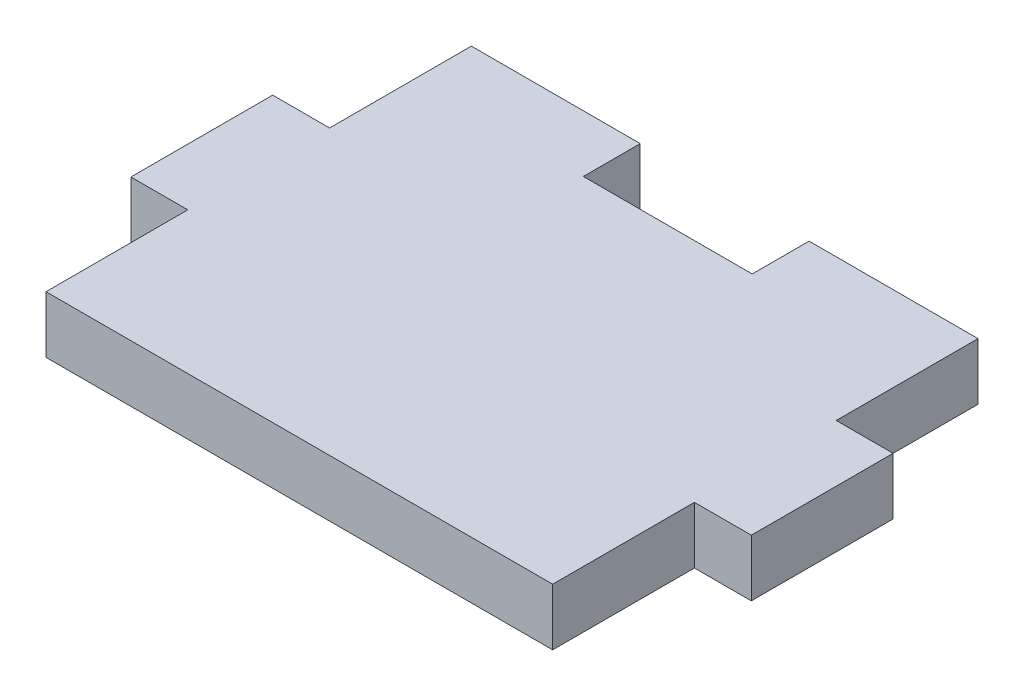
ISO-10303-21;
HEADER;
FILE_DESCRIPTION(('STEP AP214'),'2;1');
FILE_NAME('part.step','',(''),(''),'','','');
FILE_SCHEMA(('AUTOMOTIVE_DESIGN { 1 0 10303 214 1 1 1 1 }'));
ENDSEC;
DATA;
#1=APPLICATION_CONTEXT('core data for automotive mechanical design processes');
#2=APPLICATION_PROTOCOL_DEFINITION('international standard','automotive_design',2000,#1);
#3=PRODUCT_CONTEXT('',#1,'mechanical');
#4=PRODUCT('Part','Part','',(#3));
#5=PRODUCT_RELATED_PRODUCT_CATEGORY('part','',(#4));
#6=PRODUCT_DEFINITION_FORMATION('','',#4);
#7=PRODUCT_DEFINITION_CONTEXT('part definition',#1,'design');
#8=PRODUCT_DEFINITION('design','',#6,#7);
#9=PRODUCT_DEFINITION_SHAPE('','',#8);
#10=(LENGTH_UNIT() NAMED_UNIT(*) SI_UNIT(.MILLI.,.METRE.));
#11=(NAMED_UNIT(*) PLANE_ANGLE_UNIT() SI_UNIT($,.RADIAN.));
#12=(NAMED_UNIT(*) SI_UNIT($,.STERADIAN.) SOLID_ANGLE_UNIT());
#13=UNCERTAINTY_MEASURE_WITH_UNIT(LENGTH_MEASURE(1.E-05),#10,'distance_accuracy_value','');
#14=(GEOMETRIC_REPRESENTATION_CONTEXT(3) GLOBAL_UNCERTAINTY_ASSIGNED_CONTEXT((#13)) GLOBAL_UNIT_ASSIGNED_CONTEXT((#10,
#11,#12)) REPRESENTATION_CONTEXT('',''));
#15=CARTESIAN_POINT('',(0.,0.,0.));
#16=DIRECTION('',(0.,0.,1.));
#17=DIRECTION('',(1.,0.,0.));
#18=AXIS2_PLACEMENT_3D('',#15,#16,#17);
#19=CARTESIAN_POINT('',(-23.749,2.667,-19.939));
#20=DIRECTION('',(0.,0.,1.));
#21=DIRECTION('',(1.,0.,0.));
#22=AXIS2_PLACEMENT_3D('',#19,#20,#21);
#23=PLANE('',#22);
#24=DIRECTION('',(-1.,0.,0.));
#25=VECTOR('',#24,1.);
#26=CARTESIAN_POINT('',(-23.749,2.667,-19.939));
#27=LINE('',#26,#25);
#28=CARTESIAN_POINT('',(-7.91633333333333,2.66700000000001,-19.939));
#29=VERTEX_POINT('',#28);
#30=CARTESIAN_POINT('',(-23.749,2.667,-19.939));
#31=VERTEX_POINT('',#30);
#32=EDGE_CURVE('E172',#29,#31,#27,.T.);
#33=ORIENTED_EDGE('',*,*,#32,.F.);
#34=DIRECTION('',(0.,-1.,0.));
#35=VECTOR('',#34,1.);
#36=CARTESIAN_POINT('',(-7.91633333333333,-2.66699999999999,-19.939));
#37=LINE('',#36,#35);
#38=CARTESIAN_POINT('',(-7.91633333333333,-2.66699999999999,-19.939));
#39=VERTEX_POINT('',#38);
#40=EDGE_CURVE('E164',#29,#39,#37,.T.);
#41=ORIENTED_EDGE('',*,*,#40,.T.);
#42=DIRECTION('',(-1.,0.,0.));
#43=VECTOR('',#42,1.);
#44=CARTESIAN_POINT('',(-23.749,-2.667,-19.939));
#45=LINE('',#44,#43);
#46=CARTESIAN_POINT('',(-23.749,-2.667,-19.939));
#47=VERTEX_POINT('',#46);
#48=EDGE_CURVE('E222',#39,#47,#45,.T.);
#49=ORIENTED_EDGE('',*,*,#48,.T.);
#50=DIRECTION('',(0.,-1.,0.));
#51=VECTOR('',#50,1.);
#52=CARTESIAN_POINT('',(-23.749,2.667,-19.939));
#53=LINE('',#52,#51);
#54=EDGE_CURVE('E208',#31,#47,#53,.T.);
#55=ORIENTED_EDGE('',*,*,#54,.F.);
#56=EDGE_LOOP('',(#33,#41,#49,#55));
#57=FACE_BOUND('',#56,.T.);
#58=ADVANCED_FACE('F33',(#57),#23,.F.);
#59=CARTESIAN_POINT('',(23.749,2.667,19.939));
#60=DIRECTION('',(-1.,0.,0.));
#61=DIRECTION('',(0.,0.,1.));
#62=AXIS2_PLACEMENT_3D('',#59,#60,#61);
#63=PLANE('',#62);
#64=DIRECTION('',(0.,1.,0.));
#65=VECTOR('',#64,1.);
#66=CARTESIAN_POINT('',(23.749,-2.667,-6.64633333333334));
#67=LINE('',#66,#65);
#68=CARTESIAN_POINT('',(23.749,-2.667,-6.64633333333334));
#69=VERTEX_POINT('',#68);
#70=CARTESIAN_POINT('',(23.749,2.667,-6.64633333333334));
#71=VERTEX_POINT('',#70);
#72=EDGE_CURVE('E215',#69,#71,#67,.T.);
#73=ORIENTED_EDGE('',*,*,#72,.F.);
#74=DIRECTION('',(0.,0.,-1.));
#75=VECTOR('',#74,1.);
#76=CARTESIAN_POINT('',(23.749,-2.667,19.939));
#77=LINE('',#76,#75);
#78=CARTESIAN_POINT('',(23.749,-2.667,-19.939));
#79=VERTEX_POINT('',#78);
#80=EDGE_CURVE('E214',#69,#79,#77,.T.);
#81=ORIENTED_EDGE('',*,*,#80,.T.);
#82=DIRECTION('',(0.,-1.,0.));
#83=VECTOR('',#82,1.);
#84=CARTESIAN_POINT('',(23.749,2.667,-19.939));
#85=LINE('',#84,#83);
#86=CARTESIAN_POINT('',(23.749,2.667,-19.939));
#87=VERTEX_POINT('',#86);
#88=EDGE_CURVE('E41',#87,#79,#85,.T.);
#89=ORIENTED_EDGE('',*,*,#88,.F.);
#90=DIRECTION('',(0.,0.,-1.));
#91=VECTOR('',#90,1.);
#92=CARTESIAN_POINT('',(23.749,2.667,19.939));
#93=LINE('',#92,#91);
#94=EDGE_CURVE('E170',#71,#87,#93,.T.);
#95=ORIENTED_EDGE('',*,*,#94,.F.);
#96=EDGE_LOOP('',(#73,#81,#89,#95));
#97=FACE_BOUND('',#96,.T.);
#98=ADVANCED_FACE('F212',(#97),#63,.F.);
#99=CARTESIAN_POINT('',(-23.749,2.667,19.939));
#100=DIRECTION('',(1.,0.,0.));
#101=DIRECTION('',(0.,0.,-1.));
#102=AXIS2_PLACEMENT_3D('',#99,#100,#101);
#103=PLANE('',#102);
#104=DIRECTION('',(0.,1.,0.));
#105=VECTOR('',#104,1.);
#106=CARTESIAN_POINT('',(-23.749,-2.667,6.64633333333333));
#107=LINE('',#106,#105);
#108=CARTESIAN_POINT('',(-23.749,-2.667,6.64633333333333));
#109=VERTEX_POINT('',#108);
#110=CARTESIAN_POINT('',(-23.749,2.667,6.64633333333333));
#111=VERTEX_POINT('',#110);
#112=EDGE_CURVE('E219',#109,#111,#107,.T.);
#113=ORIENTED_EDGE('',*,*,#112,.F.);
#114=DIRECTION('',(0.,0.,1.));
#115=VECTOR('',#114,1.);
#116=CARTESIAN_POINT('',(-23.749,-2.667,19.939));
#117=LINE('',#116,#115);
#118=CARTESIAN_POINT('',(-23.749,-2.667,19.939));
#119=VERTEX_POINT('',#118);
#120=EDGE_CURVE('E190',#109,#119,#117,.T.);
#121=ORIENTED_EDGE('',*,*,#120,.T.);
#122=DIRECTION('',(0.,-1.,0.));
#123=VECTOR('',#122,1.);
#124=CARTESIAN_POINT('',(-23.749,2.667,19.939));
#125=LINE('',#124,#123);
#126=CARTESIAN_POINT('',(-23.749,2.667,19.939));
#127=VERTEX_POINT('',#126);
#128=EDGE_CURVE('E205',#127,#119,#125,.T.);
#129=ORIENTED_EDGE('',*,*,#128,.F.);
#130=DIRECTION('',(0.,0.,1.));
#131=VECTOR('',#130,1.);
#132=CARTESIAN_POINT('',(-23.749,2.667,19.939));
#133=LINE('',#132,#131);
#134=EDGE_CURVE('E171',#111,#127,#133,.T.);
#135=ORIENTED_EDGE('',*,*,#134,.F.);
#136=EDGE_LOOP('',(#113,#121,#129,#135));
#137=FACE_BOUND('',#136,.T.);
#138=ADVANCED_FACE('F320',(#137),#103,.F.);
#139=CARTESIAN_POINT('',(23.749,-2.667,19.939));
#140=VERTEX_POINT('',#139);
#141=CARTESIAN_POINT('',(23.749,-2.667,6.64633333333333));
#142=VERTEX_POINT('',#141);
#143=EDGE_CURVE('E218',#140,#142,#77,.T.);
#144=ORIENTED_EDGE('',*,*,#143,.T.);
#145=DIRECTION('',(0.,1.,0.));
#146=VECTOR('',#145,1.);
#147=CARTESIAN_POINT('',(23.749,-2.667,6.64633333333333));
#148=LINE('',#147,#146);
#149=CARTESIAN_POINT('',(23.749,2.667,6.64633333333333));
#150=VERTEX_POINT('',#149);
#151=EDGE_CURVE('E240',#142,#150,#148,.T.);
#152=ORIENTED_EDGE('',*,*,#151,.T.);
#153=CARTESIAN_POINT('',(23.749,2.667,19.939));
#154=VERTEX_POINT('',#153);
#155=EDGE_CURVE('E176',#154,#150,#93,.T.);
#156=ORIENTED_EDGE('',*,*,#155,.F.);
#157=DIRECTION('',(0.,-1.,0.));
#158=VECTOR('',#157,1.);
#159=CARTESIAN_POINT('',(23.749,2.667,19.939));
#160=LINE('',#159,#158);
#161=EDGE_CURVE('E202',#154,#140,#160,.T.);
#162=ORIENTED_EDGE('',*,*,#161,.T.);
#163=EDGE_LOOP('',(#144,#152,#156,#162));
#164=FACE_BOUND('',#163,.T.);
#165=ADVANCED_FACE('F35',(#164),#63,.F.);
#166=CARTESIAN_POINT('',(7.91633333333331,-2.667,-19.939));
#167=VERTEX_POINT('',#166);
#168=EDGE_CURVE('E163',#79,#167,#45,.T.);
#169=ORIENTED_EDGE('',*,*,#168,.T.);
#170=DIRECTION('',(0.,1.,0.));
#171=VECTOR('',#170,1.);
#172=CARTESIAN_POINT('',(7.91633333333334,-2.66699999999999,-19.939));
#173=LINE('',#172,#171);
#174=CARTESIAN_POINT('',(7.91633333333334,2.66700000000001,-19.939));
#175=VERTEX_POINT('',#174);
#176=EDGE_CURVE('E48',#167,#175,#173,.T.);
#177=ORIENTED_EDGE('',*,*,#176,.T.);
#178=EDGE_CURVE('E160',#87,#175,#27,.T.);
#179=ORIENTED_EDGE('',*,*,#178,.F.);
#180=ORIENTED_EDGE('',*,*,#88,.T.);
#181=EDGE_LOOP('',(#169,#177,#179,#180));
#182=FACE_BOUND('',#181,.T.);
#183=ADVANCED_FACE('F158',(#182),#23,.F.);
#184=CARTESIAN_POINT('',(-23.749,-2.667,-6.64633333333333));
#185=VERTEX_POINT('',#184);
#186=EDGE_CURVE('E193',#47,#185,#117,.T.);
#187=ORIENTED_EDGE('',*,*,#186,.T.);
#188=DIRECTION('',(0.,1.,0.));
#189=VECTOR('',#188,1.);
#190=CARTESIAN_POINT('',(-23.749,-2.667,-6.64633333333333));
#191=LINE('',#190,#189);
#192=CARTESIAN_POINT('',(-23.749,2.667,-6.64633333333333));
#193=VERTEX_POINT('',#192);
#194=EDGE_CURVE('E269',#185,#193,#191,.T.);
#195=ORIENTED_EDGE('',*,*,#194,.T.);
#196=EDGE_CURVE('E174',#31,#193,#133,.T.);
#197=ORIENTED_EDGE('',*,*,#196,.F.);
#198=ORIENTED_EDGE('',*,*,#54,.T.);
#199=EDGE_LOOP('',(#187,#195,#197,#198));
#200=FACE_BOUND('',#199,.T.);
#201=ADVANCED_FACE('F344',(#200),#103,.F.);
#202=CARTESIAN_POINT('',(-23.749,2.667,19.939));
#203=DIRECTION('',(0.,0.,-1.));
#204=DIRECTION('',(-1.,0.,0.));
#205=AXIS2_PLACEMENT_3D('',#202,#203,#204);
#206=PLANE('',#205);
#207=DIRECTION('',(1.,0.,0.));
#208=VECTOR('',#207,1.);
#209=CARTESIAN_POINT('',(-23.749,-2.667,19.939));
#210=LINE('',#209,#208);
#211=EDGE_CURVE('E199',#119,#140,#210,.T.);
#212=ORIENTED_EDGE('',*,*,#211,.T.);
#213=ORIENTED_EDGE('',*,*,#161,.F.);
#214=DIRECTION('',(1.,0.,0.));
#215=VECTOR('',#214,1.);
#216=CARTESIAN_POINT('',(-23.749,2.667,19.939));
#217=LINE('',#216,#215);
#218=EDGE_CURVE('E183',#127,#154,#217,.T.);
#219=ORIENTED_EDGE('',*,*,#218,.F.);
#220=ORIENTED_EDGE('',*,*,#128,.T.);
#221=EDGE_LOOP('',(#212,#213,#219,#220));
#222=FACE_BOUND('',#221,.T.);
#223=ADVANCED_FACE('F313',(#222),#206,.F.);
#224=CARTESIAN_POINT('',(23.749,2.667,-19.939));
#225=DIRECTION('',(0.,-1.,0.));
#226=DIRECTION('',(0.,0.,-1.));
#227=AXIS2_PLACEMENT_3D('',#224,#225,#226);
#228=PLANE('',#227);
#229=DIRECTION('',(-1.,0.,0.));
#230=VECTOR('',#229,1.);
#231=CARTESIAN_POINT('',(-7.91633333333333,2.66700000000001,-14.605));
#232=LINE('',#231,#230);
#233=CARTESIAN_POINT('',(7.91633333333334,2.66700000000001,-14.605));
#234=VERTEX_POINT('',#233);
#235=CARTESIAN_POINT('',(-7.91633333333333,2.66700000000001,-14.605));
#236=VERTEX_POINT('',#235);
#237=EDGE_CURVE('E360',#234,#236,#232,.T.);
#238=ORIENTED_EDGE('',*,*,#237,.T.);
#239=DIRECTION('',(0.,0.,1.));
#240=VECTOR('',#239,1.);
#241=CARTESIAN_POINT('',(-7.91633333333333,2.66700000000001,-19.939));
#242=LINE('',#241,#240);
#243=EDGE_CURVE('E152',#29,#236,#242,.T.);
#244=ORIENTED_EDGE('',*,*,#243,.F.);
#245=ORIENTED_EDGE('',*,*,#32,.T.);
#246=ORIENTED_EDGE('',*,*,#196,.T.);
#247=DIRECTION('',(-1.,0.,0.));
#248=VECTOR('',#247,1.);
#249=CARTESIAN_POINT('',(-23.749,2.667,-6.64633333333333));
#250=LINE('',#249,#248);
#251=CARTESIAN_POINT('',(-29.083,2.667,-6.64633333333333));
#252=VERTEX_POINT('',#251);
#253=EDGE_CURVE('E258',#193,#252,#250,.T.);
#254=ORIENTED_EDGE('',*,*,#253,.T.);
#255=DIRECTION('',(0.,0.,1.));
#256=VECTOR('',#255,1.);
#257=CARTESIAN_POINT('',(-29.083,2.667,-6.64633333333333));
#258=LINE('',#257,#256);
#259=CARTESIAN_POINT('',(-29.083,2.667,6.64633333333333));
#260=VERTEX_POINT('',#259);
#261=EDGE_CURVE('E254',#252,#260,#258,.T.);
#262=ORIENTED_EDGE('',*,*,#261,.T.);
#263=DIRECTION('',(1.,0.,0.));
#264=VECTOR('',#263,1.);
#265=CARTESIAN_POINT('',(-23.749,2.667,6.64633333333333));
#266=LINE('',#265,#264);
#267=EDGE_CURVE('E257',#260,#111,#266,.T.);
#268=ORIENTED_EDGE('',*,*,#267,.T.);
#269=ORIENTED_EDGE('',*,*,#134,.T.);
#270=ORIENTED_EDGE('',*,*,#218,.T.);
#271=ORIENTED_EDGE('',*,*,#155,.T.);
#272=DIRECTION('',(1.,0.,0.));
#273=VECTOR('',#272,1.);
#274=CARTESIAN_POINT('',(23.749,2.667,6.64633333333333));
#275=LINE('',#274,#273);
#276=CARTESIAN_POINT('',(29.083,2.667,6.64633333333333));
#277=VERTEX_POINT('',#276);
#278=EDGE_CURVE('E56',#150,#277,#275,.T.);
#279=ORIENTED_EDGE('',*,*,#278,.T.);
#280=DIRECTION('',(0.,0.,-1.));
#281=VECTOR('',#280,1.);
#282=CARTESIAN_POINT('',(29.083,2.667,-6.64633333333334));
#283=LINE('',#282,#281);
#284=CARTESIAN_POINT('',(29.083,2.667,-6.64633333333334));
#285=VERTEX_POINT('',#284);
#286=EDGE_CURVE('E237',#277,#285,#283,.T.);
#287=ORIENTED_EDGE('',*,*,#286,.T.);
#288=DIRECTION('',(-1.,0.,0.));
#289=VECTOR('',#288,1.);
#290=CARTESIAN_POINT('',(23.749,2.667,-6.64633333333334));
#291=LINE('',#290,#289);
#292=EDGE_CURVE('E229',#285,#71,#291,.T.);
#293=ORIENTED_EDGE('',*,*,#292,.T.);
#294=ORIENTED_EDGE('',*,*,#94,.T.);
#295=ORIENTED_EDGE('',*,*,#178,.T.);
#296=DIRECTION('',(0.,0.,1.));
#297=VECTOR('',#296,1.);
#298=CARTESIAN_POINT('',(7.91633333333334,2.66700000000001,-19.939));
#299=LINE('',#298,#297);
#300=EDGE_CURVE('E146',#175,#234,#299,.T.);
#301=ORIENTED_EDGE('',*,*,#300,.T.);
#302=EDGE_LOOP('',(#238,#244,#245,#246,#254,#262,#268,#269,#270,#271,#279,#287,#293,#294,#295,#301));
#303=FACE_BOUND('',#302,.T.);
#304=ADVANCED_FACE('F167',(#303),#228,.F.);
#305=CARTESIAN_POINT('',(23.749,-2.667,-19.939));
#306=DIRECTION('',(0.,-1.,0.));
#307=DIRECTION('',(0.,0.,-1.));
#308=AXIS2_PLACEMENT_3D('',#305,#306,#307);
#309=PLANE('',#308);
#310=ORIENTED_EDGE('',*,*,#168,.F.);
#311=ORIENTED_EDGE('',*,*,#80,.F.);
#312=DIRECTION('',(-1.,0.,0.));
#313=VECTOR('',#312,1.);
#314=CARTESIAN_POINT('',(23.749,-2.667,-6.64633333333334));
#315=LINE('',#314,#313);
#316=CARTESIAN_POINT('',(29.083,-2.667,-6.64633333333334));
#317=VERTEX_POINT('',#316);
#318=EDGE_CURVE('E234',#317,#69,#315,.T.);
#319=ORIENTED_EDGE('',*,*,#318,.F.);
#320=DIRECTION('',(0.,0.,-1.));
#321=VECTOR('',#320,1.);
#322=CARTESIAN_POINT('',(29.083,-2.667,-6.64633333333334));
#323=LINE('',#322,#321);
#324=CARTESIAN_POINT('',(29.083,-2.667,6.64633333333333));
#325=VERTEX_POINT('',#324);
#326=EDGE_CURVE('E241',#325,#317,#323,.T.);
#327=ORIENTED_EDGE('',*,*,#326,.F.);
#328=DIRECTION('',(1.,0.,0.));
#329=VECTOR('',#328,1.);
#330=CARTESIAN_POINT('',(23.749,-2.667,6.64633333333333));
#331=LINE('',#330,#329);
#332=EDGE_CURVE('E236',#142,#325,#331,.T.);
#333=ORIENTED_EDGE('',*,*,#332,.F.);
#334=ORIENTED_EDGE('',*,*,#143,.F.);
#335=ORIENTED_EDGE('',*,*,#211,.F.);
#336=ORIENTED_EDGE('',*,*,#120,.F.);
#337=DIRECTION('',(1.,0.,0.));
#338=VECTOR('',#337,1.);
#339=CARTESIAN_POINT('',(-23.749,-2.667,6.64633333333333));
#340=LINE('',#339,#338);
#341=CARTESIAN_POINT('',(-29.083,-2.667,6.64633333333333));
#342=VERTEX_POINT('',#341);
#343=EDGE_CURVE('E252',#342,#109,#340,.T.);
#344=ORIENTED_EDGE('',*,*,#343,.F.);
#345=DIRECTION('',(0.,0.,1.));
#346=VECTOR('',#345,1.);
#347=CARTESIAN_POINT('',(-29.083,-2.667,-6.64633333333333));
#348=LINE('',#347,#346);
#349=CARTESIAN_POINT('',(-29.083,-2.667,-6.64633333333333));
#350=VERTEX_POINT('',#349);
#351=EDGE_CURVE('E249',#350,#342,#348,.T.);
#352=ORIENTED_EDGE('',*,*,#351,.F.);
#353=DIRECTION('',(-1.,0.,0.));
#354=VECTOR('',#353,1.);
#355=CARTESIAN_POINT('',(-23.749,-2.667,-6.64633333333333));
#356=LINE('',#355,#354);
#357=EDGE_CURVE('E253',#185,#350,#356,.T.);
#358=ORIENTED_EDGE('',*,*,#357,.F.);
#359=ORIENTED_EDGE('',*,*,#186,.F.);
#360=ORIENTED_EDGE('',*,*,#48,.F.);
#361=DIRECTION('',(0.,0.,1.));
#362=VECTOR('',#361,1.);
#363=CARTESIAN_POINT('',(-7.91633333333333,-2.66699999999999,-19.939));
#364=LINE('',#363,#362);
#365=CARTESIAN_POINT('',(-7.91633333333333,-2.66699999999999,-14.605));
#366=VERTEX_POINT('',#365);
#367=EDGE_CURVE('E231',#39,#366,#364,.T.);
#368=ORIENTED_EDGE('',*,*,#367,.T.);
#369=DIRECTION('',(1.,0.,0.));
#370=VECTOR('',#369,1.);
#371=CARTESIAN_POINT('',(23.749,-2.667,-14.605));
#372=LINE('',#371,#370);
#373=CARTESIAN_POINT('',(7.91633333333331,-2.667,-14.605));
#374=VERTEX_POINT('',#373);
#375=EDGE_CURVE('E11',#366,#374,#372,.T.);
#376=ORIENTED_EDGE('',*,*,#375,.T.);
#377=DIRECTION('',(0.,0.,1.));
#378=VECTOR('',#377,1.);
#379=CARTESIAN_POINT('',(7.91633333333334,-2.66699999999999,-19.939));
#380=LINE('',#379,#378);
#381=EDGE_CURVE('E153',#167,#374,#380,.T.);
#382=ORIENTED_EDGE('',*,*,#381,.F.);
#383=EDGE_LOOP('',(#310,#311,#319,#327,#333,#334,#335,#336,#344,#352,#358,#359,#360,#368,#376,#382));
#384=FACE_BOUND('',#383,.T.);
#385=ADVANCED_FACE('F221',(#384),#309,.T.);
#386=CARTESIAN_POINT('',(-23.749,-2.667,6.64633333333333));
#387=DIRECTION('',(0.,0.,1.));
#388=DIRECTION('',(1.,0.,0.));
#389=AXIS2_PLACEMENT_3D('',#386,#387,#388);
#390=PLANE('',#389);
#391=ORIENTED_EDGE('',*,*,#267,.F.);
#392=DIRECTION('',(0.,1.,0.));
#393=VECTOR('',#392,1.);
#394=CARTESIAN_POINT('',(-29.083,-2.667,6.64633333333333));
#395=LINE('',#394,#393);
#396=EDGE_CURVE('E261',#342,#260,#395,.T.);
#397=ORIENTED_EDGE('',*,*,#396,.F.);
#398=ORIENTED_EDGE('',*,*,#343,.T.);
#399=ORIENTED_EDGE('',*,*,#112,.T.);
#400=EDGE_LOOP('',(#391,#397,#398,#399));
#401=FACE_BOUND('',#400,.T.);
#402=ADVANCED_FACE('F324',(#401),#390,.T.);
#403=CARTESIAN_POINT('',(-29.083,-2.667,-6.64633333333333));
#404=DIRECTION('',(-1.,0.,0.));
#405=DIRECTION('',(0.,0.,1.));
#406=AXIS2_PLACEMENT_3D('',#403,#404,#405);
#407=PLANE('',#406);
#408=ORIENTED_EDGE('',*,*,#261,.F.);
#409=DIRECTION('',(0.,1.,0.));
#410=VECTOR('',#409,1.);
#411=CARTESIAN_POINT('',(-29.083,-2.667,-6.64633333333333));
#412=LINE('',#411,#410);
#413=EDGE_CURVE('E329',#350,#252,#412,.T.);
#414=ORIENTED_EDGE('',*,*,#413,.F.);
#415=ORIENTED_EDGE('',*,*,#351,.T.);
#416=ORIENTED_EDGE('',*,*,#396,.T.);
#417=EDGE_LOOP('',(#408,#414,#415,#416));
#418=FACE_BOUND('',#417,.T.);
#419=ADVANCED_FACE('F328',(#418),#407,.T.);
#420=CARTESIAN_POINT('',(-23.749,-2.667,-6.64633333333333));
#421=DIRECTION('',(0.,0.,-1.));
#422=DIRECTION('',(-1.,0.,0.));
#423=AXIS2_PLACEMENT_3D('',#420,#421,#422);
#424=PLANE('',#423);
#425=ORIENTED_EDGE('',*,*,#253,.F.);
#426=ORIENTED_EDGE('',*,*,#194,.F.);
#427=ORIENTED_EDGE('',*,*,#357,.T.);
#428=ORIENTED_EDGE('',*,*,#413,.T.);
#429=EDGE_LOOP('',(#425,#426,#427,#428));
#430=FACE_BOUND('',#429,.T.);
#431=ADVANCED_FACE('F339',(#430),#424,.T.);
#432=CARTESIAN_POINT('',(23.749,-2.667,-6.64633333333334));
#433=DIRECTION('',(0.,0.,-1.));
#434=DIRECTION('',(-1.,0.,0.));
#435=AXIS2_PLACEMENT_3D('',#432,#433,#434);
#436=PLANE('',#435);
#437=ORIENTED_EDGE('',*,*,#292,.F.);
#438=DIRECTION('',(0.,1.,0.));
#439=VECTOR('',#438,1.);
#440=CARTESIAN_POINT('',(29.083,-2.667,-6.64633333333334));
#441=LINE('',#440,#439);
#442=EDGE_CURVE('E299',#317,#285,#441,.T.);
#443=ORIENTED_EDGE('',*,*,#442,.F.);
#444=ORIENTED_EDGE('',*,*,#318,.T.);
#445=ORIENTED_EDGE('',*,*,#72,.T.);
#446=EDGE_LOOP('',(#437,#443,#444,#445));
#447=FACE_BOUND('',#446,.T.);
#448=ADVANCED_FACE('F306',(#447),#436,.T.);
#449=CARTESIAN_POINT('',(29.083,-2.667,-6.64633333333334));
#450=DIRECTION('',(1.,0.,0.));
#451=DIRECTION('',(0.,0.,-1.));
#452=AXIS2_PLACEMENT_3D('',#449,#450,#451);
#453=PLANE('',#452);
#454=ORIENTED_EDGE('',*,*,#286,.F.);
#455=DIRECTION('',(0.,1.,0.));
#456=VECTOR('',#455,1.);
#457=CARTESIAN_POINT('',(29.083,-2.667,6.64633333333333));
#458=LINE('',#457,#456);
#459=EDGE_CURVE('E286',#325,#277,#458,.T.);
#460=ORIENTED_EDGE('',*,*,#459,.F.);
#461=ORIENTED_EDGE('',*,*,#326,.T.);
#462=ORIENTED_EDGE('',*,*,#442,.T.);
#463=EDGE_LOOP('',(#454,#460,#461,#462));
#464=FACE_BOUND('',#463,.T.);
#465=ADVANCED_FACE('F303',(#464),#453,.T.);
#466=CARTESIAN_POINT('',(23.749,-2.667,6.64633333333333));
#467=DIRECTION('',(0.,0.,1.));
#468=DIRECTION('',(1.,0.,0.));
#469=AXIS2_PLACEMENT_3D('',#466,#467,#468);
#470=PLANE('',#469);
#471=ORIENTED_EDGE('',*,*,#278,.F.);
#472=ORIENTED_EDGE('',*,*,#151,.F.);
#473=ORIENTED_EDGE('',*,*,#332,.T.);
#474=ORIENTED_EDGE('',*,*,#459,.T.);
#475=EDGE_LOOP('',(#471,#472,#473,#474));
#476=FACE_BOUND('',#475,.T.);
#477=ADVANCED_FACE('F300',(#476),#470,.T.);
#478=CARTESIAN_POINT('',(23.749,-2.667,-14.605));
#479=DIRECTION('',(0.,0.,-1.));
#480=DIRECTION('',(-1.,0.,0.));
#481=AXIS2_PLACEMENT_3D('',#478,#479,#480);
#482=PLANE('',#481);
#483=DIRECTION('',(0.,-1.,0.));
#484=VECTOR('',#483,1.);
#485=CARTESIAN_POINT('',(-7.91633333333333,-2.66699999999999,-14.605));
#486=LINE('',#485,#484);
#487=EDGE_CURVE('E165',#236,#366,#486,.T.);
#488=ORIENTED_EDGE('',*,*,#487,.F.);
#489=ORIENTED_EDGE('',*,*,#237,.F.);
#490=DIRECTION('',(0.,1.,0.));
#491=VECTOR('',#490,1.);
#492=CARTESIAN_POINT('',(7.91633333333334,-2.66699999999999,-14.605));
#493=LINE('',#492,#491);
#494=EDGE_CURVE('E148',#374,#234,#493,.T.);
#495=ORIENTED_EDGE('',*,*,#494,.F.);
#496=ORIENTED_EDGE('',*,*,#375,.F.);
#497=EDGE_LOOP('',(#488,#489,#495,#496));
#498=FACE_BOUND('',#497,.T.);
#499=ADVANCED_FACE('F373',(#498),#482,.T.);
#500=CARTESIAN_POINT('',(-7.91633333333333,-2.66699999999999,-19.939));
#501=DIRECTION('',(-1.,0.,0.));
#502=DIRECTION('',(0.,0.,1.));
#503=AXIS2_PLACEMENT_3D('',#500,#501,#502);
#504=PLANE('',#503);
#505=ORIENTED_EDGE('',*,*,#487,.T.);
#506=ORIENTED_EDGE('',*,*,#367,.F.);
#507=ORIENTED_EDGE('',*,*,#40,.F.);
#508=ORIENTED_EDGE('',*,*,#243,.T.);
#509=EDGE_LOOP('',(#505,#506,#507,#508));
#510=FACE_BOUND('',#509,.T.);
#511=ADVANCED_FACE('F371',(#510),#504,.F.);
#512=CARTESIAN_POINT('',(7.91633333333334,-2.66699999999999,-19.939));
#513=DIRECTION('',(1.,0.,0.));
#514=DIRECTION('',(0.,1.,0.));
#515=AXIS2_PLACEMENT_3D('',#512,#513,#514);
#516=PLANE('',#515);
#517=ORIENTED_EDGE('',*,*,#494,.T.);
#518=ORIENTED_EDGE('',*,*,#300,.F.);
#519=ORIENTED_EDGE('',*,*,#176,.F.);
#520=ORIENTED_EDGE('',*,*,#381,.T.);
#521=EDGE_LOOP('',(#517,#518,#519,#520));
#522=FACE_BOUND('',#521,.T.);
#523=ADVANCED_FACE('F147',(#522),#516,.F.);
#524=CLOSED_SHELL('',(#58,#98,#138,#165,#183,#201,#223,#304,#385,#402,#419,#431,#448,#465,#477,
#499,#511,#523));
#525=MANIFOLD_SOLID_BREP('B2',#524);
#526=ADVANCED_BREP_SHAPE_REPRESENTATION('',(#18,#525),#14);
#527=SHAPE_DEFINITION_REPRESENTATION(#9,#526);
ENDSEC;
END-ISO-10303-21;
